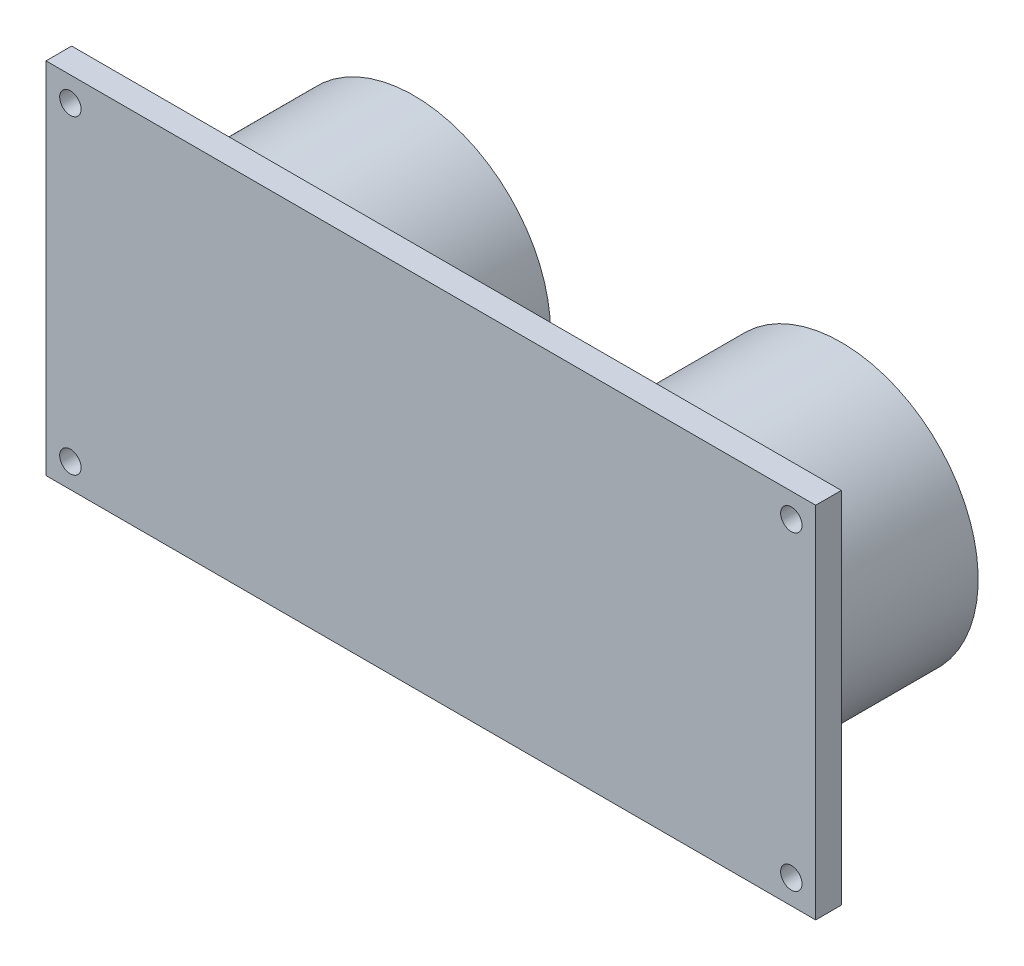
ISO-10303-21;
HEADER;
FILE_DESCRIPTION(('STEP AP214'),'2;1');
FILE_NAME('part.step','',(''),(''),'','','');
FILE_SCHEMA(('AUTOMOTIVE_DESIGN { 1 0 10303 214 1 1 1 1 }'));
ENDSEC;
DATA;
#1=APPLICATION_CONTEXT('core data for automotive mechanical design processes');
#2=APPLICATION_PROTOCOL_DEFINITION('international standard','automotive_design',2000,#1);
#3=PRODUCT_CONTEXT('',#1,'mechanical');
#4=PRODUCT('Part','Part','',(#3));
#5=PRODUCT_RELATED_PRODUCT_CATEGORY('part','',(#4));
#6=PRODUCT_DEFINITION_FORMATION('','',#4);
#7=PRODUCT_DEFINITION_CONTEXT('part definition',#1,'design');
#8=PRODUCT_DEFINITION('design','',#6,#7);
#9=PRODUCT_DEFINITION_SHAPE('','',#8);
#10=(LENGTH_UNIT() NAMED_UNIT(*) SI_UNIT(.MILLI.,.METRE.));
#11=(NAMED_UNIT(*) PLANE_ANGLE_UNIT() SI_UNIT($,.RADIAN.));
#12=(NAMED_UNIT(*) SI_UNIT($,.STERADIAN.) SOLID_ANGLE_UNIT());
#13=UNCERTAINTY_MEASURE_WITH_UNIT(LENGTH_MEASURE(1.E-05),#10,'distance_accuracy_value','');
#14=(GEOMETRIC_REPRESENTATION_CONTEXT(3) GLOBAL_UNCERTAINTY_ASSIGNED_CONTEXT((#13)) GLOBAL_UNIT_ASSIGNED_CONTEXT((#10,
#11,#12)) REPRESENTATION_CONTEXT('',''));
#15=CARTESIAN_POINT('',(0.,0.,0.));
#16=DIRECTION('',(0.,0.,1.));
#17=DIRECTION('',(1.,0.,0.));
#18=AXIS2_PLACEMENT_3D('',#15,#16,#17);
#19=CARTESIAN_POINT('',(0.,0.,1.5));
#20=DIRECTION('',(0.,0.,-1.));
#21=DIRECTION('',(-1.,0.,0.));
#22=AXIS2_PLACEMENT_3D('',#19,#20,#21);
#23=PLANE('',#22);
#24=DIRECTION('',(0.,-1.,0.));
#25=VECTOR('',#24,1.);
#26=CARTESIAN_POINT('',(0.,0.,1.5));
#27=LINE('',#26,#25);
#28=CARTESIAN_POINT('',(0.,21.,1.5));
#29=VERTEX_POINT('',#28);
#30=CARTESIAN_POINT('',(0.,0.,1.5));
#31=VERTEX_POINT('',#30);
#32=EDGE_CURVE('E85',#29,#31,#27,.T.);
#33=ORIENTED_EDGE('',*,*,#32,.T.);
#34=DIRECTION('',(1.,0.,0.));
#35=VECTOR('',#34,1.);
#36=CARTESIAN_POINT('',(0.,0.,1.5));
#37=LINE('',#36,#35);
#38=CARTESIAN_POINT('',(45.,0.,1.5));
#39=VERTEX_POINT('',#38);
#40=EDGE_CURVE('E80',#31,#39,#37,.T.);
#41=ORIENTED_EDGE('',*,*,#40,.T.);
#42=DIRECTION('',(0.,1.,0.));
#43=VECTOR('',#42,1.);
#44=CARTESIAN_POINT('',(45.,0.,1.5));
#45=LINE('',#44,#43);
#46=CARTESIAN_POINT('',(45.,21.,1.5));
#47=VERTEX_POINT('',#46);
#48=EDGE_CURVE('E83',#39,#47,#45,.T.);
#49=ORIENTED_EDGE('',*,*,#48,.T.);
#50=DIRECTION('',(-1.,0.,0.));
#51=VECTOR('',#50,1.);
#52=CARTESIAN_POINT('',(0.,21.,1.5));
#53=LINE('',#52,#51);
#54=EDGE_CURVE('E50',#47,#29,#53,.T.);
#55=ORIENTED_EDGE('',*,*,#54,.T.);
#56=EDGE_LOOP('',(#33,#41,#49,#55));
#57=FACE_BOUND('',#56,.T.);
#58=CARTESIAN_POINT('',(1.425,19.575,1.5));
#59=DIRECTION('',(0.,0.,1.));
#60=DIRECTION('',(1.,0.,0.));
#61=AXIS2_PLACEMENT_3D('',#58,#59,#60);
#62=CIRCLE('',#61,0.625);
#63=CARTESIAN_POINT('',(2.05,19.575,1.5));
#64=VERTEX_POINT('',#63);
#65=EDGE_CURVE('E100',#64,#64,#62,.T.);
#66=ORIENTED_EDGE('',*,*,#65,.F.);
#67=EDGE_LOOP('',(#66));
#68=FACE_BOUND('',#67,.T.);
#69=CARTESIAN_POINT('',(43.575,19.575,1.5));
#70=DIRECTION('',(0.,0.,1.));
#71=DIRECTION('',(-1.,0.,0.));
#72=AXIS2_PLACEMENT_3D('',#69,#70,#71);
#73=CIRCLE('',#72,0.625000000000006);
#74=CARTESIAN_POINT('',(42.95,19.575,1.5));
#75=VERTEX_POINT('',#74);
#76=EDGE_CURVE('E115',#75,#75,#73,.T.);
#77=ORIENTED_EDGE('',*,*,#76,.F.);
#78=EDGE_LOOP('',(#77));
#79=FACE_BOUND('',#78,.T.);
#80=CARTESIAN_POINT('',(43.575,1.42499999999999,1.5));
#81=DIRECTION('',(0.,0.,1.));
#82=DIRECTION('',(1.,0.,0.));
#83=AXIS2_PLACEMENT_3D('',#80,#81,#82);
#84=CIRCLE('',#83,0.625000000000006);
#85=CARTESIAN_POINT('',(44.2,1.42499999999999,1.5));
#86=VERTEX_POINT('',#85);
#87=EDGE_CURVE('E121',#86,#86,#84,.T.);
#88=ORIENTED_EDGE('',*,*,#87,.F.);
#89=EDGE_LOOP('',(#88));
#90=FACE_BOUND('',#89,.T.);
#91=CARTESIAN_POINT('',(1.425,1.42499999999999,1.5));
#92=DIRECTION('',(0.,0.,1.));
#93=DIRECTION('',(-1.,0.,0.));
#94=AXIS2_PLACEMENT_3D('',#91,#92,#93);
#95=CIRCLE('',#94,0.624999999999999);
#96=CARTESIAN_POINT('',(0.8,1.42499999999999,1.5));
#97=VERTEX_POINT('',#96);
#98=EDGE_CURVE('E127',#97,#97,#95,.T.);
#99=ORIENTED_EDGE('',*,*,#98,.F.);
#100=EDGE_LOOP('',(#99));
#101=FACE_BOUND('',#100,.T.);
#102=ADVANCED_FACE('F33',(#57,#68,#79,#90,#101),#23,.F.);
#103=CARTESIAN_POINT('',(0.,0.,0.));
#104=DIRECTION('',(0.,0.,-1.));
#105=DIRECTION('',(-1.,0.,0.));
#106=AXIS2_PLACEMENT_3D('',#103,#104,#105);
#107=PLANE('',#106);
#108=CARTESIAN_POINT('',(9.99999999999999,10.5,0.));
#109=DIRECTION('',(0.,0.,-1.));
#110=DIRECTION('',(1.,0.,0.));
#111=AXIS2_PLACEMENT_3D('',#108,#109,#110);
#112=CIRCLE('',#111,8.);
#113=CARTESIAN_POINT('',(18.,10.5,0.));
#114=VERTEX_POINT('',#113);
#115=EDGE_CURVE('E142',#114,#114,#112,.T.);
#116=ORIENTED_EDGE('',*,*,#115,.F.);
#117=EDGE_LOOP('',(#116));
#118=FACE_BOUND('',#117,.T.);
#119=CARTESIAN_POINT('',(35.,10.5,0.));
#120=DIRECTION('',(0.,0.,-1.));
#121=DIRECTION('',(-1.,0.,0.));
#122=AXIS2_PLACEMENT_3D('',#119,#120,#121);
#123=CIRCLE('',#122,8.);
#124=CARTESIAN_POINT('',(27.,10.5,0.));
#125=VERTEX_POINT('',#124);
#126=EDGE_CURVE('E136',#125,#125,#123,.T.);
#127=ORIENTED_EDGE('',*,*,#126,.F.);
#128=EDGE_LOOP('',(#127));
#129=FACE_BOUND('',#128,.T.);
#130=CARTESIAN_POINT('',(43.575,1.42499999999999,0.));
#131=DIRECTION('',(0.,0.,1.));
#132=DIRECTION('',(1.,0.,0.));
#133=AXIS2_PLACEMENT_3D('',#130,#131,#132);
#134=CIRCLE('',#133,0.625000000000006);
#135=CARTESIAN_POINT('',(44.2,1.42499999999999,0.));
#136=VERTEX_POINT('',#135);
#137=EDGE_CURVE('E124',#136,#136,#134,.T.);
#138=ORIENTED_EDGE('',*,*,#137,.T.);
#139=EDGE_LOOP('',(#138));
#140=FACE_BOUND('',#139,.T.);
#141=CARTESIAN_POINT('',(1.425,19.575,0.));
#142=DIRECTION('',(0.,0.,1.));
#143=DIRECTION('',(1.,0.,0.));
#144=AXIS2_PLACEMENT_3D('',#141,#142,#143);
#145=CIRCLE('',#144,0.625);
#146=CARTESIAN_POINT('',(2.05,19.575,0.));
#147=VERTEX_POINT('',#146);
#148=EDGE_CURVE('E112',#147,#147,#145,.T.);
#149=ORIENTED_EDGE('',*,*,#148,.T.);
#150=EDGE_LOOP('',(#149));
#151=FACE_BOUND('',#150,.T.);
#152=DIRECTION('',(0.,-1.,0.));
#153=VECTOR('',#152,1.);
#154=CARTESIAN_POINT('',(0.,0.,0.));
#155=LINE('',#154,#153);
#156=CARTESIAN_POINT('',(0.,21.,0.));
#157=VERTEX_POINT('',#156);
#158=CARTESIAN_POINT('',(0.,0.,0.));
#159=VERTEX_POINT('',#158);
#160=EDGE_CURVE('E97',#157,#159,#155,.T.);
#161=ORIENTED_EDGE('',*,*,#160,.F.);
#162=DIRECTION('',(-1.,0.,0.));
#163=VECTOR('',#162,1.);
#164=CARTESIAN_POINT('',(0.,21.,0.));
#165=LINE('',#164,#163);
#166=CARTESIAN_POINT('',(45.,21.,0.));
#167=VERTEX_POINT('',#166);
#168=EDGE_CURVE('E73',#167,#157,#165,.T.);
#169=ORIENTED_EDGE('',*,*,#168,.F.);
#170=DIRECTION('',(0.,1.,0.));
#171=VECTOR('',#170,1.);
#172=CARTESIAN_POINT('',(45.,0.,0.));
#173=LINE('',#172,#171);
#174=CARTESIAN_POINT('',(45.,0.,0.));
#175=VERTEX_POINT('',#174);
#176=EDGE_CURVE('E67',#175,#167,#173,.T.);
#177=ORIENTED_EDGE('',*,*,#176,.F.);
#178=DIRECTION('',(1.,0.,0.));
#179=VECTOR('',#178,1.);
#180=CARTESIAN_POINT('',(0.,0.,0.));
#181=LINE('',#180,#179);
#182=EDGE_CURVE('E89',#159,#175,#181,.T.);
#183=ORIENTED_EDGE('',*,*,#182,.F.);
#184=EDGE_LOOP('',(#161,#169,#177,#183));
#185=FACE_BOUND('',#184,.T.);
#186=CARTESIAN_POINT('',(43.575,19.575,0.));
#187=DIRECTION('',(0.,0.,1.));
#188=DIRECTION('',(-1.,0.,0.));
#189=AXIS2_PLACEMENT_3D('',#186,#187,#188);
#190=CIRCLE('',#189,0.625000000000006);
#191=CARTESIAN_POINT('',(42.95,19.575,0.));
#192=VERTEX_POINT('',#191);
#193=EDGE_CURVE('E118',#192,#192,#190,.T.);
#194=ORIENTED_EDGE('',*,*,#193,.T.);
#195=EDGE_LOOP('',(#194));
#196=FACE_BOUND('',#195,.T.);
#197=CARTESIAN_POINT('',(1.425,1.42499999999999,0.));
#198=DIRECTION('',(0.,0.,1.));
#199=DIRECTION('',(-1.,0.,0.));
#200=AXIS2_PLACEMENT_3D('',#197,#198,#199);
#201=CIRCLE('',#200,0.624999999999999);
#202=CARTESIAN_POINT('',(0.8,1.42499999999999,0.));
#203=VERTEX_POINT('',#202);
#204=EDGE_CURVE('E130',#203,#203,#201,.T.);
#205=ORIENTED_EDGE('',*,*,#204,.T.);
#206=EDGE_LOOP('',(#205));
#207=FACE_BOUND('',#206,.T.);
#208=ADVANCED_FACE('F108',(#118,#129,#140,#151,#185,#196,#207),#107,.T.);
#209=CARTESIAN_POINT('',(0.,0.,1.5));
#210=DIRECTION('',(1.,0.,0.));
#211=DIRECTION('',(0.,0.,-1.));
#212=AXIS2_PLACEMENT_3D('',#209,#210,#211);
#213=PLANE('',#212);
#214=ORIENTED_EDGE('',*,*,#160,.T.);
#215=DIRECTION('',(0.,0.,-1.));
#216=VECTOR('',#215,1.);
#217=CARTESIAN_POINT('',(0.,0.,1.5));
#218=LINE('',#217,#216);
#219=EDGE_CURVE('E11',#31,#159,#218,.T.);
#220=ORIENTED_EDGE('',*,*,#219,.F.);
#221=ORIENTED_EDGE('',*,*,#32,.F.);
#222=DIRECTION('',(0.,0.,-1.));
#223=VECTOR('',#222,1.);
#224=CARTESIAN_POINT('',(0.,21.,1.5));
#225=LINE('',#224,#223);
#226=EDGE_CURVE('E93',#29,#157,#225,.T.);
#227=ORIENTED_EDGE('',*,*,#226,.T.);
#228=EDGE_LOOP('',(#214,#220,#221,#227));
#229=FACE_BOUND('',#228,.T.);
#230=ADVANCED_FACE('F35',(#229),#213,.F.);
#231=CARTESIAN_POINT('',(0.,0.,1.5));
#232=DIRECTION('',(0.,1.,0.));
#233=DIRECTION('',(0.,0.,1.));
#234=AXIS2_PLACEMENT_3D('',#231,#232,#233);
#235=PLANE('',#234);
#236=ORIENTED_EDGE('',*,*,#182,.T.);
#237=DIRECTION('',(0.,0.,-1.));
#238=VECTOR('',#237,1.);
#239=CARTESIAN_POINT('',(45.,0.,1.5));
#240=LINE('',#239,#238);
#241=EDGE_CURVE('E42',#39,#175,#240,.T.);
#242=ORIENTED_EDGE('',*,*,#241,.F.);
#243=ORIENTED_EDGE('',*,*,#40,.F.);
#244=ORIENTED_EDGE('',*,*,#219,.T.);
#245=EDGE_LOOP('',(#236,#242,#243,#244));
#246=FACE_BOUND('',#245,.T.);
#247=ADVANCED_FACE('F88',(#246),#235,.F.);
#248=CARTESIAN_POINT('',(45.,0.,1.5));
#249=DIRECTION('',(-1.,0.,0.));
#250=DIRECTION('',(0.,0.,1.));
#251=AXIS2_PLACEMENT_3D('',#248,#249,#250);
#252=PLANE('',#251);
#253=ORIENTED_EDGE('',*,*,#176,.T.);
#254=DIRECTION('',(0.,0.,-1.));
#255=VECTOR('',#254,1.);
#256=CARTESIAN_POINT('',(45.,21.,1.5));
#257=LINE('',#256,#255);
#258=EDGE_CURVE('E90',#47,#167,#257,.T.);
#259=ORIENTED_EDGE('',*,*,#258,.F.);
#260=ORIENTED_EDGE('',*,*,#48,.F.);
#261=ORIENTED_EDGE('',*,*,#241,.T.);
#262=EDGE_LOOP('',(#253,#259,#260,#261));
#263=FACE_BOUND('',#262,.T.);
#264=ADVANCED_FACE('F91',(#263),#252,.F.);
#265=CARTESIAN_POINT('',(0.,21.,1.5));
#266=DIRECTION('',(0.,-1.,0.));
#267=DIRECTION('',(0.,0.,-1.));
#268=AXIS2_PLACEMENT_3D('',#265,#266,#267);
#269=PLANE('',#268);
#270=ORIENTED_EDGE('',*,*,#168,.T.);
#271=ORIENTED_EDGE('',*,*,#226,.F.);
#272=ORIENTED_EDGE('',*,*,#54,.F.);
#273=ORIENTED_EDGE('',*,*,#258,.T.);
#274=EDGE_LOOP('',(#270,#271,#272,#273));
#275=FACE_BOUND('',#274,.T.);
#276=ADVANCED_FACE('F105',(#275),#269,.F.);
#277=CARTESIAN_POINT('',(1.425,19.575,1.5));
#278=DIRECTION('',(0.,0.,-1.));
#279=DIRECTION('',(-1.,0.,0.));
#280=AXIS2_PLACEMENT_3D('',#277,#278,#279);
#281=CYLINDRICAL_SURFACE('',#280,0.625);
#282=ORIENTED_EDGE('',*,*,#65,.T.);
#283=EDGE_LOOP('',(#282));
#284=FACE_BOUND('',#283,.T.);
#285=ORIENTED_EDGE('',*,*,#148,.F.);
#286=EDGE_LOOP('',(#285));
#287=FACE_BOUND('',#286,.T.);
#288=ADVANCED_FACE('F166',(#284,#287),#281,.F.);
#289=CARTESIAN_POINT('',(43.575,19.575,1.5));
#290=DIRECTION('',(0.,0.,-1.));
#291=DIRECTION('',(-1.,0.,0.));
#292=AXIS2_PLACEMENT_3D('',#289,#290,#291);
#293=CYLINDRICAL_SURFACE('',#292,0.625000000000006);
#294=ORIENTED_EDGE('',*,*,#76,.T.);
#295=EDGE_LOOP('',(#294));
#296=FACE_BOUND('',#295,.T.);
#297=ORIENTED_EDGE('',*,*,#193,.F.);
#298=EDGE_LOOP('',(#297));
#299=FACE_BOUND('',#298,.T.);
#300=ADVANCED_FACE('F168',(#296,#299),#293,.F.);
#301=CARTESIAN_POINT('',(43.575,1.42499999999999,1.5));
#302=DIRECTION('',(0.,0.,-1.));
#303=DIRECTION('',(-1.,0.,0.));
#304=AXIS2_PLACEMENT_3D('',#301,#302,#303);
#305=CYLINDRICAL_SURFACE('',#304,0.625000000000006);
#306=ORIENTED_EDGE('',*,*,#87,.T.);
#307=EDGE_LOOP('',(#306));
#308=FACE_BOUND('',#307,.T.);
#309=ORIENTED_EDGE('',*,*,#137,.F.);
#310=EDGE_LOOP('',(#309));
#311=FACE_BOUND('',#310,.T.);
#312=ADVANCED_FACE('F175',(#308,#311),#305,.F.);
#313=CARTESIAN_POINT('',(1.425,1.42499999999999,1.5));
#314=DIRECTION('',(0.,0.,-1.));
#315=DIRECTION('',(-1.,0.,0.));
#316=AXIS2_PLACEMENT_3D('',#313,#314,#315);
#317=CYLINDRICAL_SURFACE('',#316,0.624999999999999);
#318=ORIENTED_EDGE('',*,*,#98,.T.);
#319=EDGE_LOOP('',(#318));
#320=FACE_BOUND('',#319,.T.);
#321=ORIENTED_EDGE('',*,*,#204,.F.);
#322=EDGE_LOOP('',(#321));
#323=FACE_BOUND('',#322,.T.);
#324=ADVANCED_FACE('F202',(#320,#323),#317,.F.);
#325=CARTESIAN_POINT('',(35.,10.5,-10.));
#326=DIRECTION('',(0.,0.,1.));
#327=DIRECTION('',(1.,0.,0.));
#328=AXIS2_PLACEMENT_3D('',#325,#326,#327);
#329=CYLINDRICAL_SURFACE('',#328,8.);
#330=CARTESIAN_POINT('',(35.,10.5,-10.));
#331=DIRECTION('',(0.,0.,-1.));
#332=DIRECTION('',(-1.,0.,0.));
#333=AXIS2_PLACEMENT_3D('',#330,#331,#332);
#334=CIRCLE('',#333,8.);
#335=CARTESIAN_POINT('',(27.,10.5,-10.));
#336=VERTEX_POINT('',#335);
#337=EDGE_CURVE('E133',#336,#336,#334,.T.);
#338=ORIENTED_EDGE('',*,*,#337,.F.);
#339=EDGE_LOOP('',(#338));
#340=FACE_BOUND('',#339,.T.);
#341=ORIENTED_EDGE('',*,*,#126,.T.);
#342=EDGE_LOOP('',(#341));
#343=FACE_BOUND('',#342,.T.);
#344=ADVANCED_FACE('F207',(#340,#343),#329,.T.);
#345=CARTESIAN_POINT('',(35.,10.5,-10.));
#346=DIRECTION('',(0.,0.,-1.));
#347=DIRECTION('',(-1.,0.,0.));
#348=AXIS2_PLACEMENT_3D('',#345,#346,#347);
#349=PLANE('',#348);
#350=ORIENTED_EDGE('',*,*,#337,.T.);
#351=EDGE_LOOP('',(#350));
#352=FACE_BOUND('',#351,.T.);
#353=ADVANCED_FACE('F153',(#352),#349,.T.);
#354=CARTESIAN_POINT('',(9.99999999999999,10.5,-10.));
#355=DIRECTION('',(0.,0.,1.));
#356=DIRECTION('',(1.,0.,0.));
#357=AXIS2_PLACEMENT_3D('',#354,#355,#356);
#358=CYLINDRICAL_SURFACE('',#357,8.);
#359=CARTESIAN_POINT('',(9.99999999999999,10.5,-10.));
#360=DIRECTION('',(0.,0.,-1.));
#361=DIRECTION('',(1.,0.,0.));
#362=AXIS2_PLACEMENT_3D('',#359,#360,#361);
#363=CIRCLE('',#362,8.);
#364=CARTESIAN_POINT('',(18.,10.5,-10.));
#365=VERTEX_POINT('',#364);
#366=EDGE_CURVE('E139',#365,#365,#363,.T.);
#367=ORIENTED_EDGE('',*,*,#366,.F.);
#368=EDGE_LOOP('',(#367));
#369=FACE_BOUND('',#368,.T.);
#370=ORIENTED_EDGE('',*,*,#115,.T.);
#371=EDGE_LOOP('',(#370));
#372=FACE_BOUND('',#371,.T.);
#373=ADVANCED_FACE('F150',(#369,#372),#358,.T.);
#374=CARTESIAN_POINT('',(9.99999999999999,10.5,-10.));
#375=DIRECTION('',(0.,0.,1.));
#376=DIRECTION('',(1.,0.,0.));
#377=AXIS2_PLACEMENT_3D('',#374,#375,#376);
#378=PLANE('',#377);
#379=ORIENTED_EDGE('',*,*,#366,.T.);
#380=EDGE_LOOP('',(#379));
#381=FACE_BOUND('',#380,.T.);
#382=ADVANCED_FACE('F148',(#381),#378,.F.);
#383=CLOSED_SHELL('',(#102,#208,#230,#247,#264,#276,#288,#300,#312,#324,#344,#353,#373,#382));
#384=MANIFOLD_SOLID_BREP('B2',#383);
#385=ADVANCED_BREP_SHAPE_REPRESENTATION('',(#18,#384),#14);
#386=SHAPE_DEFINITION_REPRESENTATION(#9,#385);
ENDSEC;
END-ISO-10303-21;
